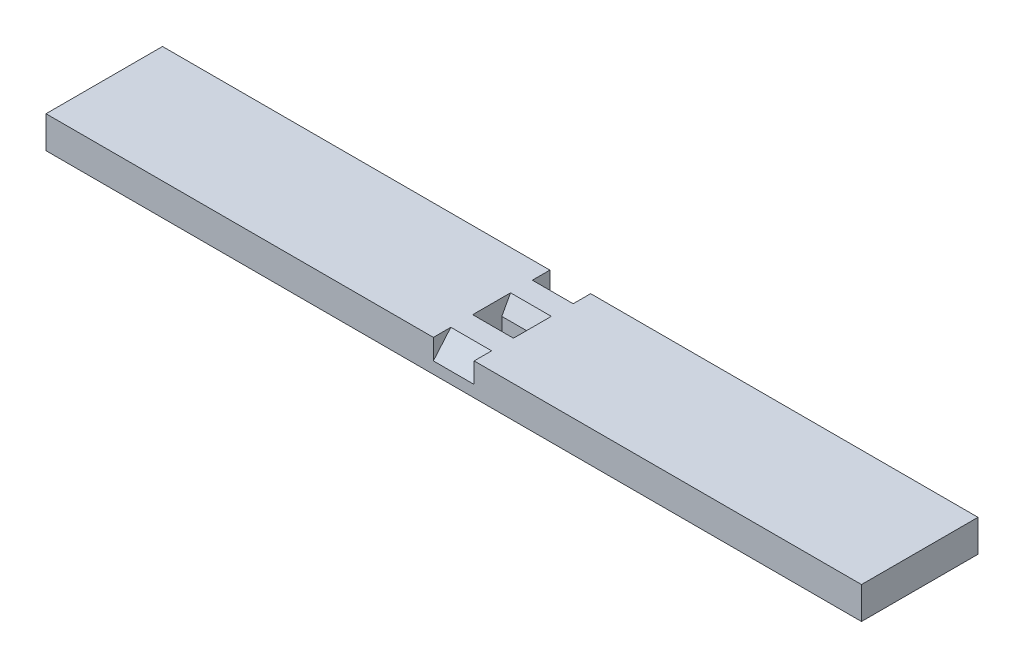
ISO-10303-21;
HEADER;
FILE_DESCRIPTION(('STEP AP214'),'2;1');
FILE_NAME('part.step','',(''),(''),'','','');
FILE_SCHEMA(('AUTOMOTIVE_DESIGN { 1 0 10303 214 1 1 1 1 }'));
ENDSEC;
DATA;
#1=APPLICATION_CONTEXT('core data for automotive mechanical design processes');
#2=APPLICATION_PROTOCOL_DEFINITION('international standard','automotive_design',2000,#1);
#3=PRODUCT_CONTEXT('',#1,'mechanical');
#4=PRODUCT('Part','Part','',(#3));
#5=PRODUCT_RELATED_PRODUCT_CATEGORY('part','',(#4));
#6=PRODUCT_DEFINITION_FORMATION('','',#4);
#7=PRODUCT_DEFINITION_CONTEXT('part definition',#1,'design');
#8=PRODUCT_DEFINITION('design','',#6,#7);
#9=PRODUCT_DEFINITION_SHAPE('','',#8);
#10=(LENGTH_UNIT() NAMED_UNIT(*) SI_UNIT(.MILLI.,.METRE.));
#11=(NAMED_UNIT(*) PLANE_ANGLE_UNIT() SI_UNIT($,.RADIAN.));
#12=(NAMED_UNIT(*) SI_UNIT($,.STERADIAN.) SOLID_ANGLE_UNIT());
#13=UNCERTAINTY_MEASURE_WITH_UNIT(LENGTH_MEASURE(1.E-05),#10,'distance_accuracy_value','');
#14=(GEOMETRIC_REPRESENTATION_CONTEXT(3) GLOBAL_UNCERTAINTY_ASSIGNED_CONTEXT((#13)) GLOBAL_UNIT_ASSIGNED_CONTEXT((#10,
#11,#12)) REPRESENTATION_CONTEXT('',''));
#15=CARTESIAN_POINT('',(0.,0.,0.));
#16=DIRECTION('',(0.,0.,1.));
#17=DIRECTION('',(1.,0.,0.));
#18=AXIS2_PLACEMENT_3D('',#15,#16,#17);
#19=CARTESIAN_POINT('',(0.,5.5,0.));
#20=DIRECTION('',(0.,0.,-1.));
#21=DIRECTION('',(-1.,0.,0.));
#22=AXIS2_PLACEMENT_3D('',#19,#20,#21);
#23=PLANE('',#22);
#24=DIRECTION('',(0.,-1.,0.));
#25=VECTOR('',#24,1.);
#26=CARTESIAN_POINT('',(66.5,2.,0.));
#27=LINE('',#26,#25);
#28=CARTESIAN_POINT('',(66.5,5.5,0.));
#29=VERTEX_POINT('',#28);
#30=CARTESIAN_POINT('',(66.5,2.,0.));
#31=VERTEX_POINT('',#30);
#32=EDGE_CURVE('E182',#29,#31,#27,.T.);
#33=ORIENTED_EDGE('',*,*,#32,.F.);
#34=DIRECTION('',(1.,0.,0.));
#35=VECTOR('',#34,1.);
#36=CARTESIAN_POINT('',(0.,5.5,0.));
#37=LINE('',#36,#35);
#38=CARTESIAN_POINT('',(0.,5.5,0.));
#39=VERTEX_POINT('',#38);
#40=EDGE_CURVE('E238',#39,#29,#37,.T.);
#41=ORIENTED_EDGE('',*,*,#40,.F.);
#42=DIRECTION('',(0.,-1.,0.));
#43=VECTOR('',#42,1.);
#44=CARTESIAN_POINT('',(0.,5.5,0.));
#45=LINE('',#44,#43);
#46=CARTESIAN_POINT('',(0.,0.,0.));
#47=VERTEX_POINT('',#46);
#48=EDGE_CURVE('E263',#39,#47,#45,.T.);
#49=ORIENTED_EDGE('',*,*,#48,.T.);
#50=DIRECTION('',(1.,0.,0.));
#51=VECTOR('',#50,1.);
#52=CARTESIAN_POINT('',(0.,0.,0.));
#53=LINE('',#52,#51);
#54=CARTESIAN_POINT('',(140.,0.,0.));
#55=VERTEX_POINT('',#54);
#56=EDGE_CURVE('E250',#47,#55,#53,.T.);
#57=ORIENTED_EDGE('',*,*,#56,.T.);
#58=DIRECTION('',(0.,-1.,0.));
#59=VECTOR('',#58,1.);
#60=CARTESIAN_POINT('',(140.,5.5,0.));
#61=LINE('',#60,#59);
#62=CARTESIAN_POINT('',(140.,5.5,0.));
#63=VERTEX_POINT('',#62);
#64=EDGE_CURVE('E260',#63,#55,#61,.T.);
#65=ORIENTED_EDGE('',*,*,#64,.F.);
#66=CARTESIAN_POINT('',(73.5,5.5,0.));
#67=VERTEX_POINT('',#66);
#68=EDGE_CURVE('E236',#67,#63,#37,.T.);
#69=ORIENTED_EDGE('',*,*,#68,.F.);
#70=DIRECTION('',(0.,-1.,0.));
#71=VECTOR('',#70,1.);
#72=CARTESIAN_POINT('',(73.5,2.,0.));
#73=LINE('',#72,#71);
#74=CARTESIAN_POINT('',(73.5,2.,0.));
#75=VERTEX_POINT('',#74);
#76=EDGE_CURVE('E56',#67,#75,#73,.T.);
#77=ORIENTED_EDGE('',*,*,#76,.T.);
#78=DIRECTION('',(-1.,0.,0.));
#79=VECTOR('',#78,1.);
#80=CARTESIAN_POINT('',(78.1097722286465,2.,0.));
#81=LINE('',#80,#79);
#82=EDGE_CURVE('E181',#75,#31,#81,.T.);
#83=ORIENTED_EDGE('',*,*,#82,.T.);
#84=EDGE_LOOP('',(#33,#41,#49,#57,#65,#69,#77,#83));
#85=FACE_BOUND('',#84,.T.);
#86=ADVANCED_FACE('F33',(#85),#23,.F.);
#87=CARTESIAN_POINT('',(0.,5.5,0.));
#88=DIRECTION('',(0.,-1.,0.));
#89=DIRECTION('',(0.,0.,-1.));
#90=AXIS2_PLACEMENT_3D('',#87,#88,#89);
#91=PLANE('',#90);
#92=DIRECTION('',(0.,0.,1.));
#93=VECTOR('',#92,1.);
#94=CARTESIAN_POINT('',(66.5,5.5,-8.25000000000002));
#95=LINE('',#94,#93);
#96=CARTESIAN_POINT('',(66.5,5.5,-13.25));
#97=VERTEX_POINT('',#96);
#98=CARTESIAN_POINT('',(66.5,5.5,-6.74785833546034));
#99=VERTEX_POINT('',#98);
#100=EDGE_CURVE('E159',#97,#99,#95,.T.);
#101=ORIENTED_EDGE('',*,*,#100,.F.);
#102=DIRECTION('',(-1.,0.,0.));
#103=VECTOR('',#102,1.);
#104=CARTESIAN_POINT('',(78.1097722286465,5.5,-13.25));
#105=LINE('',#104,#103);
#106=CARTESIAN_POINT('',(73.5,5.5,-13.25));
#107=VERTEX_POINT('',#106);
#108=EDGE_CURVE('E164',#107,#97,#105,.T.);
#109=ORIENTED_EDGE('',*,*,#108,.F.);
#110=DIRECTION('',(0.,0.,-1.));
#111=VECTOR('',#110,1.);
#112=CARTESIAN_POINT('',(73.5,5.5,-8.25000000000002));
#113=LINE('',#112,#111);
#114=CARTESIAN_POINT('',(73.5,5.5,-6.74785833546034));
#115=VERTEX_POINT('',#114);
#116=EDGE_CURVE('E147',#115,#107,#113,.T.);
#117=ORIENTED_EDGE('',*,*,#116,.F.);
#118=DIRECTION('',(-1.,0.,0.));
#119=VECTOR('',#118,1.);
#120=CARTESIAN_POINT('',(78.1097722286465,5.5,-6.74785833546034));
#121=LINE('',#120,#119);
#122=EDGE_CURVE('E216',#115,#99,#121,.T.);
#123=ORIENTED_EDGE('',*,*,#122,.T.);
#124=EDGE_LOOP('',(#101,#109,#117,#123));
#125=FACE_BOUND('',#124,.T.);
#126=DIRECTION('',(-1.,0.,0.));
#127=VECTOR('',#126,1.);
#128=CARTESIAN_POINT('',(78.1097722286465,5.5,-17.));
#129=LINE('',#128,#127);
#130=CARTESIAN_POINT('',(73.5,5.5,-17.));
#131=VERTEX_POINT('',#130);
#132=CARTESIAN_POINT('',(66.5,5.5,-17.));
#133=VERTEX_POINT('',#132);
#134=EDGE_CURVE('E48',#131,#133,#129,.T.);
#135=ORIENTED_EDGE('',*,*,#134,.T.);
#136=DIRECTION('',(0.,0.,1.));
#137=VECTOR('',#136,1.);
#138=CARTESIAN_POINT('',(66.5,5.5,-20.));
#139=LINE('',#138,#137);
#140=CARTESIAN_POINT('',(66.5,5.5,-20.));
#141=VERTEX_POINT('',#140);
#142=EDGE_CURVE('E203',#141,#133,#139,.T.);
#143=ORIENTED_EDGE('',*,*,#142,.F.);
#144=DIRECTION('',(-1.,0.,0.));
#145=VECTOR('',#144,1.);
#146=CARTESIAN_POINT('',(0.,5.5,-20.));
#147=LINE('',#146,#145);
#148=CARTESIAN_POINT('',(0.,5.5,-20.));
#149=VERTEX_POINT('',#148);
#150=EDGE_CURVE('E243',#141,#149,#147,.T.);
#151=ORIENTED_EDGE('',*,*,#150,.T.);
#152=DIRECTION('',(0.,0.,1.));
#153=VECTOR('',#152,1.);
#154=CARTESIAN_POINT('',(0.,5.5,0.));
#155=LINE('',#154,#153);
#156=EDGE_CURVE('E233',#149,#39,#155,.T.);
#157=ORIENTED_EDGE('',*,*,#156,.T.);
#158=ORIENTED_EDGE('',*,*,#40,.T.);
#159=DIRECTION('',(0.,0.,1.));
#160=VECTOR('',#159,1.);
#161=CARTESIAN_POINT('',(66.5,5.5,0.));
#162=LINE('',#161,#160);
#163=CARTESIAN_POINT('',(66.5,5.5,-3.));
#164=VERTEX_POINT('',#163);
#165=EDGE_CURVE('E184',#164,#29,#162,.T.);
#166=ORIENTED_EDGE('',*,*,#165,.F.);
#167=DIRECTION('',(-1.,0.,0.));
#168=VECTOR('',#167,1.);
#169=CARTESIAN_POINT('',(78.1097722286465,5.5,-3.));
#170=LINE('',#169,#168);
#171=CARTESIAN_POINT('',(73.5,5.5,-3.));
#172=VERTEX_POINT('',#171);
#173=EDGE_CURVE('E186',#172,#164,#170,.T.);
#174=ORIENTED_EDGE('',*,*,#173,.F.);
#175=DIRECTION('',(0.,0.,1.));
#176=VECTOR('',#175,1.);
#177=CARTESIAN_POINT('',(73.5,5.5,0.));
#178=LINE('',#177,#176);
#179=EDGE_CURVE('E188',#172,#67,#178,.T.);
#180=ORIENTED_EDGE('',*,*,#179,.T.);
#181=ORIENTED_EDGE('',*,*,#68,.T.);
#182=DIRECTION('',(0.,0.,-1.));
#183=VECTOR('',#182,1.);
#184=CARTESIAN_POINT('',(140.,5.5,0.));
#185=LINE('',#184,#183);
#186=CARTESIAN_POINT('',(140.,5.5,-20.));
#187=VERTEX_POINT('',#186);
#188=EDGE_CURVE('E241',#63,#187,#185,.T.);
#189=ORIENTED_EDGE('',*,*,#188,.T.);
#190=CARTESIAN_POINT('',(73.5,5.5,-20.));
#191=VERTEX_POINT('',#190);
#192=EDGE_CURVE('E244',#187,#191,#147,.T.);
#193=ORIENTED_EDGE('',*,*,#192,.T.);
#194=DIRECTION('',(0.,0.,1.));
#195=VECTOR('',#194,1.);
#196=CARTESIAN_POINT('',(73.5,5.5,-20.));
#197=LINE('',#196,#195);
#198=EDGE_CURVE('E207',#191,#131,#197,.T.);
#199=ORIENTED_EDGE('',*,*,#198,.T.);
#200=EDGE_LOOP('',(#135,#143,#151,#157,#158,#166,#174,#180,#181,#189,#193,#199));
#201=FACE_BOUND('',#200,.T.);
#202=ADVANCED_FACE('F170',(#125,#201),#91,.F.);
#203=CARTESIAN_POINT('',(66.5,-4.5,-8.25000000000002));
#204=DIRECTION('',(0.,0.,1.));
#205=DIRECTION('',(1.,0.,0.));
#206=AXIS2_PLACEMENT_3D('',#203,#204,#205);
#207=PLANE('',#206);
#208=DIRECTION('',(-1.,0.,0.));
#209=VECTOR('',#208,1.);
#210=CARTESIAN_POINT('',(78.1097722286465,2.75,-8.25000000000002));
#211=LINE('',#210,#209);
#212=CARTESIAN_POINT('',(73.5,2.75,-8.25000000000002));
#213=VERTEX_POINT('',#212);
#214=CARTESIAN_POINT('',(66.5,2.75,-8.25000000000002));
#215=VERTEX_POINT('',#214);
#216=EDGE_CURVE('E168',#213,#215,#211,.T.);
#217=ORIENTED_EDGE('',*,*,#216,.F.);
#218=DIRECTION('',(0.,1.,0.));
#219=VECTOR('',#218,1.);
#220=CARTESIAN_POINT('',(73.5,-4.5,-8.25000000000002));
#221=LINE('',#220,#219);
#222=CARTESIAN_POINT('',(73.5,0.,-8.25000000000002));
#223=VERTEX_POINT('',#222);
#224=EDGE_CURVE('E223',#223,#213,#221,.T.);
#225=ORIENTED_EDGE('',*,*,#224,.F.);
#226=DIRECTION('',(-1.,0.,0.));
#227=VECTOR('',#226,1.);
#228=CARTESIAN_POINT('',(0.,0.,-8.25000000000002));
#229=LINE('',#228,#227);
#230=CARTESIAN_POINT('',(66.5,0.,-8.25000000000002));
#231=VERTEX_POINT('',#230);
#232=EDGE_CURVE('E41',#223,#231,#229,.T.);
#233=ORIENTED_EDGE('',*,*,#232,.T.);
#234=DIRECTION('',(0.,1.,0.));
#235=VECTOR('',#234,1.);
#236=CARTESIAN_POINT('',(66.5,-4.5,-8.25000000000002));
#237=LINE('',#236,#235);
#238=EDGE_CURVE('E226',#231,#215,#237,.T.);
#239=ORIENTED_EDGE('',*,*,#238,.T.);
#240=EDGE_LOOP('',(#217,#225,#233,#239));
#241=FACE_BOUND('',#240,.T.);
#242=ADVANCED_FACE('F275',(#241),#207,.F.);
#243=CARTESIAN_POINT('',(66.5,-4.5,-11.75));
#244=DIRECTION('',(0.,0.,-1.));
#245=DIRECTION('',(-1.,0.,0.));
#246=AXIS2_PLACEMENT_3D('',#243,#244,#245);
#247=PLANE('',#246);
#248=DIRECTION('',(-1.,0.,0.));
#249=VECTOR('',#248,1.);
#250=CARTESIAN_POINT('',(78.1097722286465,2.75,-11.75));
#251=LINE('',#250,#249);
#252=CARTESIAN_POINT('',(73.5,2.75,-11.75));
#253=VERTEX_POINT('',#252);
#254=CARTESIAN_POINT('',(66.5,2.75,-11.75));
#255=VERTEX_POINT('',#254);
#256=EDGE_CURVE('E167',#253,#255,#251,.T.);
#257=ORIENTED_EDGE('',*,*,#256,.T.);
#258=DIRECTION('',(0.,1.,0.));
#259=VECTOR('',#258,1.);
#260=CARTESIAN_POINT('',(66.5,-4.5,-11.75));
#261=LINE('',#260,#259);
#262=CARTESIAN_POINT('',(66.5,0.,-11.75));
#263=VERTEX_POINT('',#262);
#264=EDGE_CURVE('E229',#263,#255,#261,.T.);
#265=ORIENTED_EDGE('',*,*,#264,.F.);
#266=DIRECTION('',(1.,0.,0.));
#267=VECTOR('',#266,1.);
#268=CARTESIAN_POINT('',(0.,0.,-11.75));
#269=LINE('',#268,#267);
#270=CARTESIAN_POINT('',(73.5,0.,-11.75));
#271=VERTEX_POINT('',#270);
#272=EDGE_CURVE('E266',#263,#271,#269,.T.);
#273=ORIENTED_EDGE('',*,*,#272,.T.);
#274=DIRECTION('',(0.,1.,0.));
#275=VECTOR('',#274,1.);
#276=CARTESIAN_POINT('',(73.5,-4.5,-11.75));
#277=LINE('',#276,#275);
#278=EDGE_CURVE('E222',#271,#253,#277,.T.);
#279=ORIENTED_EDGE('',*,*,#278,.T.);
#280=EDGE_LOOP('',(#257,#265,#273,#279));
#281=FACE_BOUND('',#280,.T.);
#282=ADVANCED_FACE('F286',(#281),#247,.F.);
#283=CARTESIAN_POINT('',(0.,5.5,0.));
#284=DIRECTION('',(1.,0.,0.));
#285=DIRECTION('',(0.,0.,-1.));
#286=AXIS2_PLACEMENT_3D('',#283,#284,#285);
#287=PLANE('',#286);
#288=DIRECTION('',(0.,0.,1.));
#289=VECTOR('',#288,1.);
#290=CARTESIAN_POINT('',(0.,0.,0.));
#291=LINE('',#290,#289);
#292=CARTESIAN_POINT('',(0.,0.,-20.));
#293=VERTEX_POINT('',#292);
#294=EDGE_CURVE('E225',#293,#47,#291,.T.);
#295=ORIENTED_EDGE('',*,*,#294,.T.);
#296=ORIENTED_EDGE('',*,*,#48,.F.);
#297=ORIENTED_EDGE('',*,*,#156,.F.);
#298=DIRECTION('',(0.,-1.,0.));
#299=VECTOR('',#298,1.);
#300=CARTESIAN_POINT('',(0.,5.5,-20.));
#301=LINE('',#300,#299);
#302=EDGE_CURVE('E247',#149,#293,#301,.T.);
#303=ORIENTED_EDGE('',*,*,#302,.T.);
#304=EDGE_LOOP('',(#295,#296,#297,#303));
#305=FACE_BOUND('',#304,.T.);
#306=ADVANCED_FACE('F35',(#305),#287,.F.);
#307=CARTESIAN_POINT('',(140.,5.5,0.));
#308=DIRECTION('',(-1.,0.,0.));
#309=DIRECTION('',(0.,0.,1.));
#310=AXIS2_PLACEMENT_3D('',#307,#308,#309);
#311=PLANE('',#310);
#312=DIRECTION('',(0.,0.,-1.));
#313=VECTOR('',#312,1.);
#314=CARTESIAN_POINT('',(140.,0.,0.));
#315=LINE('',#314,#313);
#316=CARTESIAN_POINT('',(140.,0.,-20.));
#317=VERTEX_POINT('',#316);
#318=EDGE_CURVE('E252',#55,#317,#315,.T.);
#319=ORIENTED_EDGE('',*,*,#318,.T.);
#320=DIRECTION('',(0.,-1.,0.));
#321=VECTOR('',#320,1.);
#322=CARTESIAN_POINT('',(140.,5.5,-20.));
#323=LINE('',#322,#321);
#324=EDGE_CURVE('E257',#187,#317,#323,.T.);
#325=ORIENTED_EDGE('',*,*,#324,.F.);
#326=ORIENTED_EDGE('',*,*,#188,.F.);
#327=ORIENTED_EDGE('',*,*,#64,.T.);
#328=EDGE_LOOP('',(#319,#325,#326,#327));
#329=FACE_BOUND('',#328,.T.);
#330=ADVANCED_FACE('F310',(#329),#311,.F.);
#331=CARTESIAN_POINT('',(0.,5.5,-20.));
#332=DIRECTION('',(0.,0.,1.));
#333=DIRECTION('',(1.,0.,0.));
#334=AXIS2_PLACEMENT_3D('',#331,#332,#333);
#335=PLANE('',#334);
#336=ORIENTED_EDGE('',*,*,#150,.F.);
#337=DIRECTION('',(0.,1.,0.));
#338=VECTOR('',#337,1.);
#339=CARTESIAN_POINT('',(66.5,2.,-20.));
#340=LINE('',#339,#338);
#341=CARTESIAN_POINT('',(66.5,2.,-20.));
#342=VERTEX_POINT('',#341);
#343=EDGE_CURVE('E196',#342,#141,#340,.T.);
#344=ORIENTED_EDGE('',*,*,#343,.F.);
#345=DIRECTION('',(-1.,0.,0.));
#346=VECTOR('',#345,1.);
#347=CARTESIAN_POINT('',(78.1097722286465,2.,-20.));
#348=LINE('',#347,#346);
#349=CARTESIAN_POINT('',(73.5,2.,-20.));
#350=VERTEX_POINT('',#349);
#351=EDGE_CURVE('E199',#350,#342,#348,.T.);
#352=ORIENTED_EDGE('',*,*,#351,.F.);
#353=DIRECTION('',(0.,1.,0.));
#354=VECTOR('',#353,1.);
#355=CARTESIAN_POINT('',(73.5,2.,-20.));
#356=LINE('',#355,#354);
#357=EDGE_CURVE('E198',#350,#191,#356,.T.);
#358=ORIENTED_EDGE('',*,*,#357,.T.);
#359=ORIENTED_EDGE('',*,*,#192,.F.);
#360=ORIENTED_EDGE('',*,*,#324,.T.);
#361=DIRECTION('',(-1.,0.,0.));
#362=VECTOR('',#361,1.);
#363=CARTESIAN_POINT('',(0.,0.,-20.));
#364=LINE('',#363,#362);
#365=EDGE_CURVE('E237',#317,#293,#364,.T.);
#366=ORIENTED_EDGE('',*,*,#365,.T.);
#367=ORIENTED_EDGE('',*,*,#302,.F.);
#368=EDGE_LOOP('',(#336,#344,#352,#358,#359,#360,#366,#367));
#369=FACE_BOUND('',#368,.T.);
#370=ADVANCED_FACE('F313',(#369),#335,.F.);
#371=CARTESIAN_POINT('',(0.,0.,0.));
#372=DIRECTION('',(0.,-1.,0.));
#373=DIRECTION('',(0.,0.,-1.));
#374=AXIS2_PLACEMENT_3D('',#371,#372,#373);
#375=PLANE('',#374);
#376=DIRECTION('',(0.,0.,1.));
#377=VECTOR('',#376,1.);
#378=CARTESIAN_POINT('',(73.5,0.,0.));
#379=LINE('',#378,#377);
#380=EDGE_CURVE('E11',#271,#223,#379,.T.);
#381=ORIENTED_EDGE('',*,*,#380,.F.);
#382=ORIENTED_EDGE('',*,*,#272,.F.);
#383=DIRECTION('',(0.,0.,-1.));
#384=VECTOR('',#383,1.);
#385=CARTESIAN_POINT('',(66.5,0.,0.));
#386=LINE('',#385,#384);
#387=EDGE_CURVE('E268',#231,#263,#386,.T.);
#388=ORIENTED_EDGE('',*,*,#387,.F.);
#389=ORIENTED_EDGE('',*,*,#232,.F.);
#390=EDGE_LOOP('',(#381,#382,#388,#389));
#391=FACE_BOUND('',#390,.T.);
#392=ORIENTED_EDGE('',*,*,#294,.F.);
#393=ORIENTED_EDGE('',*,*,#365,.F.);
#394=ORIENTED_EDGE('',*,*,#318,.F.);
#395=ORIENTED_EDGE('',*,*,#56,.F.);
#396=EDGE_LOOP('',(#392,#393,#394,#395));
#397=FACE_BOUND('',#396,.T.);
#398=ADVANCED_FACE('F283',(#391,#397),#375,.T.);
#399=CARTESIAN_POINT('',(73.5,-4.5,-8.25000000000002));
#400=DIRECTION('',(1.,0.,0.));
#401=DIRECTION('',(0.,0.,-1.));
#402=AXIS2_PLACEMENT_3D('',#399,#400,#401);
#403=PLANE('',#402);
#404=ORIENTED_EDGE('',*,*,#380,.T.);
#405=ORIENTED_EDGE('',*,*,#224,.T.);
#406=DIRECTION('',(0.,-0.877608096341531,-0.47937879514617));
#407=VECTOR('',#406,1.);
#408=CARTESIAN_POINT('',(73.5,5.5,-6.74785833546034));
#409=LINE('',#408,#407);
#410=EDGE_CURVE('E154',#115,#213,#409,.T.);
#411=ORIENTED_EDGE('',*,*,#410,.F.);
#412=ORIENTED_EDGE('',*,*,#116,.T.);
#413=DIRECTION('',(0.,0.877895572914384,-0.478852130680573));
#414=VECTOR('',#413,1.);
#415=CARTESIAN_POINT('',(73.5,5.5,-13.25));
#416=LINE('',#415,#414);
#417=EDGE_CURVE('E151',#253,#107,#416,.T.);
#418=ORIENTED_EDGE('',*,*,#417,.F.);
#419=ORIENTED_EDGE('',*,*,#278,.F.);
#420=EDGE_LOOP('',(#404,#405,#411,#412,#418,#419));
#421=FACE_BOUND('',#420,.T.);
#422=ADVANCED_FACE('F149',(#421),#403,.F.);
#423=CARTESIAN_POINT('',(66.5,-4.5,-8.25000000000002));
#424=DIRECTION('',(-1.,0.,0.));
#425=DIRECTION('',(0.,0.,1.));
#426=AXIS2_PLACEMENT_3D('',#423,#424,#425);
#427=PLANE('',#426);
#428=ORIENTED_EDGE('',*,*,#387,.T.);
#429=ORIENTED_EDGE('',*,*,#264,.T.);
#430=DIRECTION('',(0.,0.877895572914384,-0.478852130680573));
#431=VECTOR('',#430,1.);
#432=CARTESIAN_POINT('',(66.5,5.5,-13.25));
#433=LINE('',#432,#431);
#434=EDGE_CURVE('E172',#255,#97,#433,.T.);
#435=ORIENTED_EDGE('',*,*,#434,.T.);
#436=ORIENTED_EDGE('',*,*,#100,.T.);
#437=DIRECTION('',(0.,-0.877608096341531,-0.479378795146169));
#438=VECTOR('',#437,1.);
#439=CARTESIAN_POINT('',(66.5,5.5,-6.74785833546034));
#440=LINE('',#439,#438);
#441=EDGE_CURVE('E214',#99,#215,#440,.T.);
#442=ORIENTED_EDGE('',*,*,#441,.T.);
#443=ORIENTED_EDGE('',*,*,#238,.F.);
#444=EDGE_LOOP('',(#428,#429,#435,#436,#442,#443));
#445=FACE_BOUND('',#444,.T.);
#446=ADVANCED_FACE('F280',(#445),#427,.F.);
#447=CARTESIAN_POINT('',(78.1097722286465,5.5,-13.25));
#448=DIRECTION('',(0.,0.478852130680573,0.877895572914384));
#449=DIRECTION('',(0.,-0.877895572914384,0.478852130680573));
#450=AXIS2_PLACEMENT_3D('',#447,#448,#449);
#451=PLANE('',#450);
#452=ORIENTED_EDGE('',*,*,#417,.T.);
#453=ORIENTED_EDGE('',*,*,#108,.T.);
#454=ORIENTED_EDGE('',*,*,#434,.F.);
#455=ORIENTED_EDGE('',*,*,#256,.F.);
#456=EDGE_LOOP('',(#452,#453,#454,#455));
#457=FACE_BOUND('',#456,.T.);
#458=ADVANCED_FACE('F163',(#457),#451,.T.);
#459=CARTESIAN_POINT('',(78.1097722286465,5.5,-6.74785833546034));
#460=DIRECTION('',(0.,0.47937879514617,-0.877608096341531));
#461=DIRECTION('',(0.,0.877608096341531,0.47937879514617));
#462=AXIS2_PLACEMENT_3D('',#459,#460,#461);
#463=PLANE('',#462);
#464=ORIENTED_EDGE('',*,*,#410,.T.);
#465=ORIENTED_EDGE('',*,*,#216,.T.);
#466=ORIENTED_EDGE('',*,*,#441,.F.);
#467=ORIENTED_EDGE('',*,*,#122,.F.);
#468=EDGE_LOOP('',(#464,#465,#466,#467));
#469=FACE_BOUND('',#468,.T.);
#470=ADVANCED_FACE('F288',(#469),#463,.T.);
#471=CARTESIAN_POINT('',(78.1097722286465,5.5,-3.));
#472=DIRECTION('',(0.,0.650791373455969,0.759256602365297));
#473=DIRECTION('',(0.,-0.759256602365297,0.650791373455969));
#474=AXIS2_PLACEMENT_3D('',#471,#472,#473);
#475=PLANE('',#474);
#476=DIRECTION('',(0.,0.759256602365297,-0.650791373455969));
#477=VECTOR('',#476,1.);
#478=CARTESIAN_POINT('',(73.5,5.5,-3.));
#479=LINE('',#478,#477);
#480=EDGE_CURVE('E180',#75,#172,#479,.T.);
#481=ORIENTED_EDGE('',*,*,#480,.T.);
#482=ORIENTED_EDGE('',*,*,#173,.T.);
#483=DIRECTION('',(0.,0.759256602365297,-0.650791373455969));
#484=VECTOR('',#483,1.);
#485=CARTESIAN_POINT('',(66.5,5.5,-3.));
#486=LINE('',#485,#484);
#487=EDGE_CURVE('E177',#31,#164,#486,.T.);
#488=ORIENTED_EDGE('',*,*,#487,.F.);
#489=ORIENTED_EDGE('',*,*,#82,.F.);
#490=EDGE_LOOP('',(#481,#482,#488,#489));
#491=FACE_BOUND('',#490,.T.);
#492=ADVANCED_FACE('F290',(#491),#475,.T.);
#493=CARTESIAN_POINT('',(66.5,0.,0.));
#494=DIRECTION('',(1.,0.,0.));
#495=DIRECTION('',(0.,0.,-1.));
#496=AXIS2_PLACEMENT_3D('',#493,#494,#495);
#497=PLANE('',#496);
#498=ORIENTED_EDGE('',*,*,#165,.T.);
#499=ORIENTED_EDGE('',*,*,#32,.T.);
#500=ORIENTED_EDGE('',*,*,#487,.T.);
#501=EDGE_LOOP('',(#498,#499,#500));
#502=FACE_BOUND('',#501,.T.);
#503=ADVANCED_FACE('F296',(#502),#497,.T.);
#504=CARTESIAN_POINT('',(73.5,-4.5,-8.25000000000002));
#505=DIRECTION('',(1.,0.,0.));
#506=DIRECTION('',(0.,0.,-1.));
#507=AXIS2_PLACEMENT_3D('',#504,#505,#506);
#508=PLANE('',#507);
#509=ORIENTED_EDGE('',*,*,#480,.F.);
#510=ORIENTED_EDGE('',*,*,#76,.F.);
#511=ORIENTED_EDGE('',*,*,#179,.F.);
#512=EDGE_LOOP('',(#509,#510,#511));
#513=FACE_BOUND('',#512,.T.);
#514=ADVANCED_FACE('F383',(#513),#508,.F.);
#515=CARTESIAN_POINT('',(78.1097722286465,5.5,-17.));
#516=DIRECTION('',(0.,0.650791373455968,-0.759256602365297));
#517=DIRECTION('',(0.,0.759256602365297,0.650791373455968));
#518=AXIS2_PLACEMENT_3D('',#515,#516,#517);
#519=PLANE('',#518);
#520=DIRECTION('',(0.,-0.759256602365297,-0.650791373455968));
#521=VECTOR('',#520,1.);
#522=CARTESIAN_POINT('',(73.5,5.5,-17.));
#523=LINE('',#522,#521);
#524=EDGE_CURVE('E195',#131,#350,#523,.T.);
#525=ORIENTED_EDGE('',*,*,#524,.T.);
#526=ORIENTED_EDGE('',*,*,#351,.T.);
#527=DIRECTION('',(0.,-0.759256602365297,-0.650791373455968));
#528=VECTOR('',#527,1.);
#529=CARTESIAN_POINT('',(66.5,5.5,-17.));
#530=LINE('',#529,#528);
#531=EDGE_CURVE('E200',#133,#342,#530,.T.);
#532=ORIENTED_EDGE('',*,*,#531,.F.);
#533=ORIENTED_EDGE('',*,*,#134,.F.);
#534=EDGE_LOOP('',(#525,#526,#532,#533));
#535=FACE_BOUND('',#534,.T.);
#536=ADVANCED_FACE('F393',(#535),#519,.T.);
#537=CARTESIAN_POINT('',(66.5,0.,0.));
#538=DIRECTION('',(-1.,0.,0.));
#539=DIRECTION('',(0.,0.,1.));
#540=AXIS2_PLACEMENT_3D('',#537,#538,#539);
#541=PLANE('',#540);
#542=ORIENTED_EDGE('',*,*,#142,.T.);
#543=ORIENTED_EDGE('',*,*,#531,.T.);
#544=ORIENTED_EDGE('',*,*,#343,.T.);
#545=EDGE_LOOP('',(#542,#543,#544));
#546=FACE_BOUND('',#545,.T.);
#547=ADVANCED_FACE('F402',(#546),#541,.F.);
#548=CARTESIAN_POINT('',(73.5,-4.5,-8.25000000000002));
#549=DIRECTION('',(1.,0.,0.));
#550=DIRECTION('',(0.,0.,-1.));
#551=AXIS2_PLACEMENT_3D('',#548,#549,#550);
#552=PLANE('',#551);
#553=ORIENTED_EDGE('',*,*,#357,.F.);
#554=ORIENTED_EDGE('',*,*,#524,.F.);
#555=ORIENTED_EDGE('',*,*,#198,.F.);
#556=EDGE_LOOP('',(#553,#554,#555));
#557=FACE_BOUND('',#556,.T.);
#558=ADVANCED_FACE('F411',(#557),#552,.F.);
#559=CLOSED_SHELL('',(#86,#202,#242,#282,#306,#330,#370,#398,#422,#446,#458,#470,#492,#503,#514,
#536,#547,#558));
#560=MANIFOLD_SOLID_BREP('B2',#559);
#561=ADVANCED_BREP_SHAPE_REPRESENTATION('',(#18,#560),#14);
#562=SHAPE_DEFINITION_REPRESENTATION(#9,#561);
ENDSEC;
END-ISO-10303-21;
